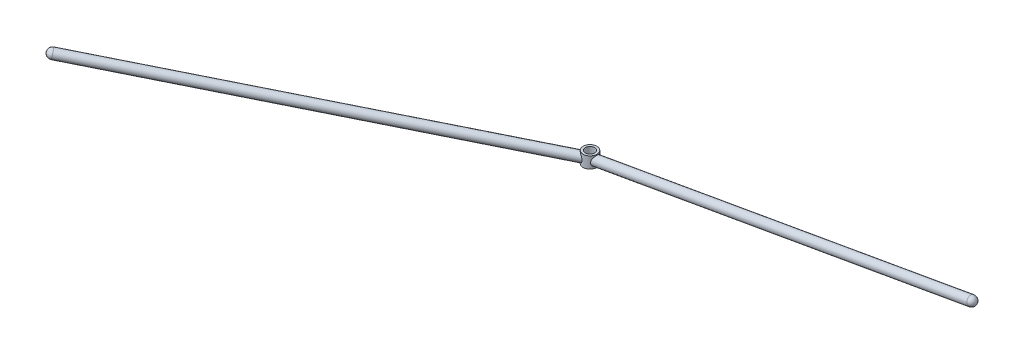
ISO-10303-21;
HEADER;
FILE_DESCRIPTION(('STEP AP214'),'2;1');
FILE_NAME('part.step','',(''),(''),'','','');
FILE_SCHEMA(('AUTOMOTIVE_DESIGN { 1 0 10303 214 1 1 1 1 }'));
ENDSEC;
DATA;
#1=APPLICATION_CONTEXT('core data for automotive mechanical design processes');
#2=APPLICATION_PROTOCOL_DEFINITION('international standard','automotive_design',2000,#1);
#3=PRODUCT_CONTEXT('',#1,'mechanical');
#4=PRODUCT('Part','Part','',(#3));
#5=PRODUCT_RELATED_PRODUCT_CATEGORY('part','',(#4));
#6=PRODUCT_DEFINITION_FORMATION('','',#4);
#7=PRODUCT_DEFINITION_CONTEXT('part definition',#1,'design');
#8=PRODUCT_DEFINITION('design','',#6,#7);
#9=PRODUCT_DEFINITION_SHAPE('','',#8);
#10=(LENGTH_UNIT() NAMED_UNIT(*) SI_UNIT(.MILLI.,.METRE.));
#11=(NAMED_UNIT(*) PLANE_ANGLE_UNIT() SI_UNIT($,.RADIAN.));
#12=(NAMED_UNIT(*) SI_UNIT($,.STERADIAN.) SOLID_ANGLE_UNIT());
#13=UNCERTAINTY_MEASURE_WITH_UNIT(LENGTH_MEASURE(1.E-05),#10,'distance_accuracy_value','');
#14=(GEOMETRIC_REPRESENTATION_CONTEXT(3) GLOBAL_UNCERTAINTY_ASSIGNED_CONTEXT((#13)) GLOBAL_UNIT_ASSIGNED_CONTEXT((#10,
#11,#12)) REPRESENTATION_CONTEXT('',''));
#15=CARTESIAN_POINT('',(0.,0.,0.));
#16=DIRECTION('',(0.,0.,1.));
#17=DIRECTION('',(1.,0.,0.));
#18=AXIS2_PLACEMENT_3D('',#15,#16,#17);
#19=CARTESIAN_POINT('',(0.,5.,0.));
#20=DIRECTION('',(0.,-1.,0.));
#21=DIRECTION('',(0.,0.,-1.));
#22=AXIS2_PLACEMENT_3D('',#19,#20,#21);
#23=CYLINDRICAL_SURFACE('',#22,3.);
#24=CARTESIAN_POINT('',(0.,0.,0.));
#25=DIRECTION('',(0.,1.,0.));
#26=DIRECTION('',(0.,0.,1.));
#27=AXIS2_PLACEMENT_3D('',#24,#25,#26);
#28=CIRCLE('',#27,3.);
#29=CARTESIAN_POINT('',(0.,0.,3.));
#30=VERTEX_POINT('',#29);
#31=EDGE_CURVE('E74',#30,#30,#28,.T.);
#32=ORIENTED_EDGE('',*,*,#31,.T.);
#33=EDGE_LOOP('',(#32));
#34=FACE_BOUND('',#33,.T.);
#35=CARTESIAN_POINT('',(0.,5.,0.));
#36=DIRECTION('',(0.,1.,0.));
#37=DIRECTION('',(0.,0.,1.));
#38=AXIS2_PLACEMENT_3D('',#35,#36,#37);
#39=CIRCLE('',#38,3.);
#40=CARTESIAN_POINT('',(0.,5.,3.));
#41=VERTEX_POINT('',#40);
#42=EDGE_CURVE('E73',#41,#41,#39,.T.);
#43=ORIENTED_EDGE('',*,*,#42,.F.);
#44=EDGE_LOOP('',(#43));
#45=FACE_BOUND('',#44,.T.);
#46=CARTESIAN_POINT('',(3.,0.528980942125396,0.));
#47=CARTESIAN_POINT('',(3.00000060768445,0.52898038671971,-0.105352816166858));
#48=CARTESIAN_POINT('',(2.99440756269553,0.536483614334048,-0.210702594024752));
#49=CARTESIAN_POINT('',(2.97254416575141,0.566163575082191,-0.418175037044795));
#50=CARTESIAN_POINT('',(2.95627103049984,0.588344133229892,-0.520296853707084));
#51=CARTESIAN_POINT('',(2.91452327004026,0.646418224151012,-0.718159576521899));
#52=CARTESIAN_POINT('',(2.88907851128459,0.68226726854435,-0.813920012750273));
#53=CARTESIAN_POINT('',(2.83101088842986,0.766597370008062,-0.997316378282564));
#54=CARTESIAN_POINT('',(2.79838681396916,0.815080557324116,-1.08495093409824));
#55=CARTESIAN_POINT('',(2.72623977201194,0.927040063832617,-1.25567529809672));
#56=CARTESIAN_POINT('',(2.68641555199647,0.991256221659713,-1.33815221701435));
#57=CARTESIAN_POINT('',(2.60476314453413,1.1319830145095,-1.49088084014653));
#58=CARTESIAN_POINT('',(2.56293219855812,1.20851093462922,-1.56111506307257));
#59=CARTESIAN_POINT('',(2.47826282941211,1.37946954172842,-1.69255687315254));
#60=CARTESIAN_POINT('',(2.43557817908405,1.47480502489805,-1.75271466141534));
#61=CARTESIAN_POINT('',(2.37800091411617,1.62688406099546,-1.82924689373969));
#62=CARTESIAN_POINT('',(2.35989391154636,1.67904985893848,-1.852462047487));
#63=CARTESIAN_POINT('',(2.32662796014547,1.78615548728428,-1.894071384172));
#64=CARTESIAN_POINT('',(2.31146749428632,1.84109387176606,-1.91246804961953));
#65=CARTESIAN_POINT('',(2.27905447335245,1.97797694746243,-1.95110550179668));
#66=CARTESIAN_POINT('',(2.26379802310381,2.06120325622948,-1.96861962747218));
#67=CARTESIAN_POINT('',(2.24279496395452,2.23033683113176,-1.99251905158083));
#68=CARTESIAN_POINT('',(2.23704032271644,2.31624177022625,-1.99891375004526));
#69=CARTESIAN_POINT('',(2.23532534003988,2.488036331558,-2.00082941628498));
#70=CARTESIAN_POINT('',(2.23934259562543,2.57392553821387,-1.99637525604013));
#71=CARTESIAN_POINT('',(2.25601136423687,2.74376960986517,-1.97751361327812));
#72=CARTESIAN_POINT('',(2.26867445453381,2.82772172496037,-1.9630927844994));
#73=CARTESIAN_POINT('',(2.30750511570784,3.02666625782287,-1.9174594078452));
#74=CARTESIAN_POINT('',(2.33710640109223,3.13994640447483,-1.88174533322008));
#75=CARTESIAN_POINT('',(2.40449507229547,3.35782529000972,-1.79483125652316));
#76=CARTESIAN_POINT('',(2.44229962232844,3.46240518027785,-1.74359869376483));
#77=CARTESIAN_POINT('',(2.52258741902155,3.66442163258846,-1.62536267251263));
#78=CARTESIAN_POINT('',(2.56516824108385,3.76159479911556,-1.55797658857411));
#79=CARTESIAN_POINT('',(2.65007422046098,3.9441393428976,-1.40871282454417));
#80=CARTESIAN_POINT('',(2.69239958104332,4.02952176551964,-1.32684887333678));
#81=CARTESIAN_POINT('',(2.76800952577604,4.17640392785802,-1.15993212018874));
#82=CARTESIAN_POINT('',(2.80176311670416,4.23955449769646,-1.07655329591663));
#83=CARTESIAN_POINT('',(2.86355508264262,4.35265873080316,-0.899343913600628));
#84=CARTESIAN_POINT('',(2.89160052357344,4.40262873280861,-0.805526502496365));
#85=CARTESIAN_POINT('',(2.93524986143201,4.47939682524608,-0.625594408988866));
#86=CARTESIAN_POINT('',(2.95215635772278,4.50868586394193,-0.540865497342784));
#87=CARTESIAN_POINT('',(2.97877115371131,4.55452533174543,-0.366933425104695));
#88=CARTESIAN_POINT('',(2.98848451471713,4.57108471813525,-0.277733457757884));
#89=CARTESIAN_POINT('',(2.99980310779582,4.59036340361394,-0.0969816579897626));
#90=CARTESIAN_POINT('',(3.00137849798229,4.59303176468015,-0.00542240514973274));
#91=CARTESIAN_POINT('',(2.99617455951865,4.58418356597702,0.176762194073289));
#92=CARTESIAN_POINT('',(2.98939465715188,4.5726660321324,0.267387475894226));
#93=CARTESIAN_POINT('',(2.96876072158394,4.53731305452876,0.440007210115846));
#94=CARTESIAN_POINT('',(2.95531886655568,4.51419443877761,0.522201763395194));
#95=CARTESIAN_POINT('',(2.92267752554253,4.45736358665806,0.68160819998983));
#96=CARTESIAN_POINT('',(2.90347505481411,4.42364585814486,0.758817475023723));
#97=CARTESIAN_POINT('',(2.85262160260887,4.33283380465544,0.93474928262287));
#98=CARTESIAN_POINT('',(2.81899552255241,4.27170793415359,1.03082107569266));
#99=CARTESIAN_POINT('',(2.74668175390765,4.13560771142606,1.21043673620206));
#100=CARTESIAN_POINT('',(2.70798569470586,4.06061037098689,1.29395938419703));
#101=CARTESIAN_POINT('',(2.62813524387254,3.89795160365836,1.44936251425342));
#102=CARTESIAN_POINT('',(2.58695104388081,3.8101035184926,1.52103081332772));
#103=CARTESIAN_POINT('',(2.50610174072881,3.62428554996893,1.65084770459144));
#104=CARTESIAN_POINT('',(2.46643679972301,3.52631459027374,1.70899485697369));
#105=CARTESIAN_POINT('',(2.39462651748582,3.3271655477022,1.80811716052594));
#106=CARTESIAN_POINT('',(2.36218027271072,3.22649417386591,1.84988627972354));
#107=CARTESIAN_POINT('',(2.30612224014837,3.01806455584342,1.91932472328987));
#108=CARTESIAN_POINT('',(2.28249497429231,2.91031912193032,1.94701878180288));
#109=CARTESIAN_POINT('',(2.25220757156907,2.71358907021476,1.98191260091815));
#110=CARTESIAN_POINT('',(2.24298742830287,2.62556867720319,1.99224383133062));
#111=CARTESIAN_POINT('',(2.23452916864881,2.44847239530751,2.00173226935032));
#112=CARTESIAN_POINT('',(2.23527843470254,2.35939798312612,2.00090360121569));
#113=CARTESIAN_POINT('',(2.24727138561336,2.18261861096862,1.98742275071259));
#114=CARTESIAN_POINT('',(2.2585424831831,2.09491783683561,1.97473968376499));
#115=CARTESIAN_POINT('',(2.29038398695863,1.92374214704113,1.93771069174425));
#116=CARTESIAN_POINT('',(2.31096319742044,1.8402713156671,1.91335372338496));
#117=CARTESIAN_POINT('',(2.35846368418658,1.68110090976915,1.85446444158261));
#118=CARTESIAN_POINT('',(2.38524633753269,1.6052771259793,1.82015089994289));
#119=CARTESIAN_POINT('',(2.44280727640162,1.46031026113406,1.74213745468454));
#120=CARTESIAN_POINT('',(2.47358691893091,1.39116946297007,1.69843435993216));
#121=CARTESIAN_POINT('',(2.54299682052757,1.24709007109985,1.5930714203266));
#122=CARTESIAN_POINT('',(2.5819841063596,1.17366749610502,1.52957109627657));
#123=CARTESIAN_POINT('',(2.65893854117567,1.0373691516282,1.39151257879646));
#124=CARTESIAN_POINT('',(2.69690475092346,0.974502831200842,1.31694458981541));
#125=CARTESIAN_POINT('',(2.77401065465476,0.851915096606001,1.14663661209537));
#126=CARTESIAN_POINT('',(2.81256013916164,0.793888852343216,1.04939384515346));
#127=CARTESIAN_POINT('',(2.88081947529461,0.693927647897705,0.844128954370339));
#128=CARTESIAN_POINT('',(2.9105350963109,0.65198218016309,0.736113927725749));
#129=CARTESIAN_POINT('',(2.95557508381903,0.58929856155613,0.524402606206571));
#130=CARTESIAN_POINT('',(2.9721060090513,0.566760938754131,0.421497170673116));
#131=CARTESIAN_POINT('',(2.99431537550236,0.536606238452704,0.212392314852877));
#132=CARTESIAN_POINT('',(2.99999938745999,0.528981501968925,0.106194613898049));
#133=CARTESIAN_POINT('',(3.,0.528980942125396,0.));
#134=B_SPLINE_CURVE_WITH_KNOTS('',3,(#46,#47,#48,#49,#50,#51,#52,#53,#54,#55,#56,#57,#58,#59,
#60,#61,#62,#63,#64,#65,#66,#67,#68,#69,#70,#71,#72,#73,#74,#75,#76,#77,#78,#79,#80,#81,#82,#83,
#84,#85,#86,#87,#88,#89,#90,#91,#92,#93,#94,#95,#96,#97,#98,#99,#100,#101,#102,#103,#104,#105,
#106,#107,#108,#109,#110,#111,#112,#113,#114,#115,#116,#117,#118,#119,#120,#121,#122,#123,#124,
#125,#126,#127,#128,#129,#130,#131,#132,#133),.UNSPECIFIED.,.T.,.F.,(4,2,2,2,2,2,2,2,2,2,2,2,2,
2,2,2,2,2,2,2,2,2,2,2,2,2,2,2,2,2,2,2,2,2,2,2,2,2,2,2,2,2,2,4),(0.,0.315650714673574,
0.63138372252156,0.946097731595019,1.2608648390414,1.59502976983552,1.92966801264527,
2.28902165024823,2.46844640271535,2.6477785319863,2.9057221437757,3.16344759154294,
3.42058273702477,3.67806287833263,4.04329238998324,4.40929359293557,4.78501274831266,
5.16037751350541,5.48888126852336,5.8169758732818,6.08951312651938,6.36185843159964,
6.63520171979458,6.90856377816817,7.16680034839535,7.4251709503158,7.77943311680552,
8.13428772477881,8.49493200935408,8.8556146797775,9.19559842306838,9.53498262804957,
9.80118718232618,10.0670548528851,10.3336171320661,10.6004320732375,10.8617787118568,
11.1232143126517,11.4358455407401,11.7487551347571,12.1058133487732,12.462637853403,
12.7809742380579,13.0991470880206),.UNSPECIFIED.);
#135=CARTESIAN_POINT('',(3.,0.528980942125396,0.));
#136=VERTEX_POINT('',#135);
#137=EDGE_CURVE('E46',#136,#136,#134,.T.);
#138=ORIENTED_EDGE('',*,*,#137,.F.);
#139=EDGE_LOOP('',(#138));
#140=FACE_BOUND('',#139,.T.);
#141=CARTESIAN_POINT('',(-2.99850266797311,2.42513233890292,-0.0947720958842282));
#142=CARTESIAN_POINT('',(-2.99850772575305,2.33300030838246,-0.0947580738950632));
#143=CARTESIAN_POINT('',(-2.99880567636641,2.24079146391625,-0.0863948523966926));
#144=CARTESIAN_POINT('',(-2.99957823963719,2.05944824644581,-0.0528544290015935));
#145=CARTESIAN_POINT('',(-3.00005301550848,1.97031679726349,-0.0276616759471098));
#146=CARTESIAN_POINT('',(-2.99993902875457,1.7982930375469,0.0374446952547342));
#147=CARTESIAN_POINT('',(-2.99935645668109,1.71536735155355,0.0772715456532838));
#148=CARTESIAN_POINT('',(-2.99558957228238,1.55654700674992,0.16894405193866));
#149=CARTESIAN_POINT('',(-2.9924034931308,1.48065716164903,0.220797852593839));
#150=CARTESIAN_POINT('',(-2.9814559781336,1.33040408082559,0.338688817739777));
#151=CARTESIAN_POINT('',(-2.97332707777821,1.25672457081368,0.405559018021943));
#152=CARTESIAN_POINT('',(-2.95050549632421,1.11882251598727,0.547440276040599));
#153=CARTESIAN_POINT('',(-2.93580947019475,1.05460481283218,0.622455467749826));
#154=CARTESIAN_POINT('',(-2.89502775271706,0.925360501651675,0.792303327565005));
#155=CARTESIAN_POINT('',(-2.86736127653136,0.86229395149993,0.888264524213738));
#156=CARTESIAN_POINT('',(-2.79911884567986,0.751243285531258,1.08429802891863));
#157=CARTESIAN_POINT('',(-2.75854266651044,0.703259432035816,1.18437040844313));
#158=CARTESIAN_POINT('',(-2.66443890389404,0.624547791947431,1.38297738696405));
#159=CARTESIAN_POINT('',(-2.61114041005973,0.593543587599598,1.4815095693859));
#160=CARTESIAN_POINT('',(-2.49168883618101,0.548937665170014,1.67461681240823));
#161=CARTESIAN_POINT('',(-2.42554657669439,0.535321370851301,1.76919512310148));
#162=CARTESIAN_POINT('',(-2.2895275099363,0.526609116117448,1.94135848502349));
#163=CARTESIAN_POINT('',(-2.22070493197636,0.529779360468929,2.01969477361224));
#164=CARTESIAN_POINT('',(-2.07637028895227,0.550552768476142,2.16780382895817));
#165=CARTESIAN_POINT('',(-2.00085862462811,0.568155068035201,2.23757710812457));
#166=CARTESIAN_POINT('',(-1.84765134174909,0.616514875963724,2.36557137403998));
#167=CARTESIAN_POINT('',(-1.77004745945715,0.646956665829968,2.42402343968906));
#168=CARTESIAN_POINT('',(-1.61365697338272,0.719986594002448,2.53082714479069));
#169=CARTESIAN_POINT('',(-1.53487020442835,0.76257644382639,2.57917735934801));
#170=CARTESIAN_POINT('',(-1.37252964404516,0.862763096251452,2.66935342025253));
#171=CARTESIAN_POINT('',(-1.28909080541583,0.921279471688508,2.71036238409087));
#172=CARTESIAN_POINT('',(-1.12702227443767,1.05046310563711,2.78166799122602));
#173=CARTESIAN_POINT('',(-1.04839938471066,1.12114703781757,2.81194975817346));
#174=CARTESIAN_POINT('',(-0.892931324651001,1.28084688232729,2.86531032417418));
#175=CARTESIAN_POINT('',(-0.816876281542525,1.37093775186613,2.8875009118794));
#176=CARTESIAN_POINT('',(-0.680528489380737,1.56389787375012,2.9226435703635));
#177=CARTESIAN_POINT('',(-0.620200912884166,1.66673813465128,2.93561616571571));
#178=CARTESIAN_POINT('',(-0.53503517919187,1.85395269988318,2.95213386138593));
#179=CARTESIAN_POINT('',(-0.505013636958384,1.93582685171823,2.95727795641155));
#180=CARTESIAN_POINT('',(-0.459044702578307,2.10350847162496,2.96476489112749));
#181=CARTESIAN_POINT('',(-0.443078220856437,2.18931043768714,2.96711153185894));
#182=CARTESIAN_POINT('',(-0.426140902806215,2.36242600687907,2.96959278262785));
#183=CARTESIAN_POINT('',(-0.425174806453039,2.44974007909468,2.96972669346515));
#184=CARTESIAN_POINT('',(-0.437457623787536,2.62337247244883,2.96793827339634));
#185=CARTESIAN_POINT('',(-0.450725640577386,2.70968929789234,2.96601317918256));
#186=CARTESIAN_POINT('',(-0.495636118036339,2.90609855688274,2.95888652257546));
#187=CARTESIAN_POINT('',(-0.53174674497237,3.01512548190201,2.95284456274402));
#188=CARTESIAN_POINT('',(-0.620123472774728,3.22596803149037,2.93555037363409));
#189=CARTESIAN_POINT('',(-0.672419456153722,3.32776988569477,2.92428848767311));
#190=CARTESIAN_POINT('',(-0.790593931239924,3.52566794312894,2.8946112859253));
#191=CARTESIAN_POINT('',(-0.856793049999138,3.62154410136214,2.87601587922842));
#192=CARTESIAN_POINT('',(-0.998659034300568,3.8036122858666,2.82988436187864));
#193=CARTESIAN_POINT('',(-1.0743233424531,3.88980691608568,2.80235066306036));
#194=CARTESIAN_POINT('',(-1.23298096969011,4.05147651355986,2.73627254820656));
#195=CARTESIAN_POINT('',(-1.31600982811399,4.12689433961318,2.69767248186452));
#196=CARTESIAN_POINT('',(-1.48639639026959,4.26400741845262,2.60765686290216));
#197=CARTESIAN_POINT('',(-1.57374893710742,4.32571855897355,2.55625629585218));
#198=CARTESIAN_POINT('',(-1.73165844303403,4.42132171687055,2.45121195421256));
#199=CARTESIAN_POINT('',(-1.80203225574742,4.45831690570599,2.40013296818603));
#200=CARTESIAN_POINT('',(-1.94124169620845,4.51955822443061,2.28899276688439));
#201=CARTESIAN_POINT('',(-2.01007859018191,4.54381525029376,2.22893928489386));
#202=CARTESIAN_POINT('',(-2.14410262937102,4.57805811633893,2.1003537922865));
#203=CARTESIAN_POINT('',(-2.20926682028198,4.58796210411576,2.03177555601542));
#204=CARTESIAN_POINT('',(-2.33297983196465,4.59242868830338,1.88842792758243));
#205=CARTESIAN_POINT('',(-2.39152970784453,4.58699373516909,1.81365952617555));
#206=CARTESIAN_POINT('',(-2.49530917904521,4.56240708383942,1.66755749431192));
#207=CARTESIAN_POINT('',(-2.54126175389483,4.54452560660472,1.5965147135029));
#208=CARTESIAN_POINT('',(-2.62558247610957,4.49753706639095,1.45368539560322));
#209=CARTESIAN_POINT('',(-2.66394903445624,4.46842765529273,1.3818987059955));
#210=CARTESIAN_POINT('',(-2.73566946868514,4.39793969311891,1.23423466201932));
#211=CARTESIAN_POINT('',(-2.76845781093938,4.35582429344528,1.1584383321349));
#212=CARTESIAN_POINT('',(-2.82606814410794,4.2620720482545,1.00980504827312));
#213=CARTESIAN_POINT('',(-2.85088537181204,4.21042953863541,0.936969886386144));
#214=CARTESIAN_POINT('',(-2.9037780390664,4.07235804585187,0.761588968978037));
#215=CARTESIAN_POINT('',(-2.92770191497296,3.9811282756434,0.66155868908584));
#216=CARTESIAN_POINT('',(-2.96386191838249,3.78413971951263,0.473992127160165));
#217=CARTESIAN_POINT('',(-2.97606017756338,3.67833511287875,0.386497097110463));
#218=CARTESIAN_POINT('',(-2.98833651020409,3.50969886421038,0.267340660654922));
#219=CARTESIAN_POINT('',(-2.9914250975918,3.45142324897005,0.229431759734243));
#220=CARTESIAN_POINT('',(-2.99601637987037,3.33188047993467,0.158568956111447));
#221=CARTESIAN_POINT('',(-2.99751863392859,3.27061249952539,0.125616432937841));
#222=CARTESIAN_POINT('',(-3.00038790808656,3.08310868166768,0.0356916701651749));
#223=CARTESIAN_POINT('',(-3.00015644481357,2.95246307317018,-0.0128660824662686));
#224=CARTESIAN_POINT('',(-2.99940617653172,2.75386628292439,-0.0616924194432777));
#225=CARTESIAN_POINT('',(-2.99910014848953,2.68874770664137,-0.0739380230010705));
#226=CARTESIAN_POINT('',(-2.99864658195601,2.55747670913496,-0.0904826666032432));
#227=CARTESIAN_POINT('',(-2.99849903422472,2.49132434841315,-0.0947821699446274));
#228=CARTESIAN_POINT('',(-2.99850266797311,2.42513233890292,-0.0947720958842282));
#229=B_SPLINE_CURVE_WITH_KNOTS('',3,(#141,#142,#143,#144,#145,#146,#147,#148,#149,#150,#151,
#152,#153,#154,#155,#156,#157,#158,#159,#160,#161,#162,#163,#164,#165,#166,#167,#168,#169,#170,
#171,#172,#173,#174,#175,#176,#177,#178,#179,#180,#181,#182,#183,#184,#185,#186,#187,#188,#189,
#190,#191,#192,#193,#194,#195,#196,#197,#198,#199,#200,#201,#202,#203,#204,#205,#206,#207,#208,
#209,#210,#211,#212,#213,#214,#215,#216,#217,#218,#219,#220,#221,#222,#223,#224,#225,#226,#227,
#228),.UNSPECIFIED.,.T.,.F.,(4,2,2,2,2,2,2,2,2,2,2,2,2,2,2,2,2,2,2,2,2,2,2,2,2,2,2,2,2,2,2,2,2,
2,2,2,2,2,2,2,2,2,2,4),(0.,0.276118243491916,0.552491984817924,0.827252832130858,
1.10220029628319,1.4006259298859,1.69920374312694,2.05185917215214,2.40452073429661,
2.75125625678261,3.09770092061391,3.40910762546654,3.72049568669252,4.02463629326096,
4.32881977082024,4.65702737990408,4.98568837782185,5.3437900766067,5.70109191434038,
5.96202928394307,6.22261169929946,6.48327645447725,6.7442914767829,7.08744118980567,
7.43122826727831,7.78404360728058,8.13676382553754,8.49128987971079,8.84540282477558,
9.1277649975686,9.40988524826866,9.69360812586042,9.97728568019475,10.2355926918707,
10.493953753098,10.7710569810065,11.0483254876688,11.4586507336232,11.8702967320558,
12.0788269637745,12.2874151295694,12.7019846069752,12.9003725836744,13.098748993007),.UNSPECIFIED.);
#230=CARTESIAN_POINT('',(-2.99850266797311,2.42513233890292,-0.0947720958842282));
#231=VERTEX_POINT('',#230);
#232=EDGE_CURVE('E38',#231,#231,#229,.T.);
#233=ORIENTED_EDGE('',*,*,#232,.F.);
#234=EDGE_LOOP('',(#233));
#235=FACE_BOUND('',#234,.T.);
#236=ADVANCED_FACE('F31',(#34,#45,#140,#235),#23,.T.);
#237=CARTESIAN_POINT('',(0.,5.,0.));
#238=DIRECTION('',(0.,1.,0.));
#239=DIRECTION('',(0.,0.,1.));
#240=AXIS2_PLACEMENT_3D('',#237,#238,#239);
#241=PLANE('',#240);
#242=CARTESIAN_POINT('',(0.,5.,0.));
#243=DIRECTION('',(0.,1.,0.));
#244=DIRECTION('',(0.,0.,1.));
#245=AXIS2_PLACEMENT_3D('',#242,#243,#244);
#246=CIRCLE('',#245,2.);
#247=CARTESIAN_POINT('',(0.,5.,2.));
#248=VERTEX_POINT('',#247);
#249=EDGE_CURVE('E80',#248,#248,#246,.T.);
#250=ORIENTED_EDGE('',*,*,#249,.F.);
#251=EDGE_LOOP('',(#250));
#252=FACE_BOUND('',#251,.T.);
#253=ORIENTED_EDGE('',*,*,#42,.T.);
#254=EDGE_LOOP('',(#253));
#255=FACE_BOUND('',#254,.T.);
#256=ADVANCED_FACE('F68',(#252,#255),#241,.T.);
#257=CARTESIAN_POINT('',(0.,0.,0.));
#258=DIRECTION('',(0.,1.,0.));
#259=DIRECTION('',(0.,0.,1.));
#260=AXIS2_PLACEMENT_3D('',#257,#258,#259);
#261=PLANE('',#260);
#262=CARTESIAN_POINT('',(0.,0.,0.));
#263=DIRECTION('',(0.,1.,0.));
#264=DIRECTION('',(0.,0.,1.));
#265=AXIS2_PLACEMENT_3D('',#262,#263,#264);
#266=CIRCLE('',#265,2.);
#267=CARTESIAN_POINT('',(0.,0.,2.));
#268=VERTEX_POINT('',#267);
#269=EDGE_CURVE('E77',#268,#268,#266,.T.);
#270=ORIENTED_EDGE('',*,*,#269,.T.);
#271=EDGE_LOOP('',(#270));
#272=FACE_BOUND('',#271,.T.);
#273=ORIENTED_EDGE('',*,*,#31,.F.);
#274=EDGE_LOOP('',(#273));
#275=FACE_BOUND('',#274,.T.);
#276=ADVANCED_FACE('F66',(#272,#275),#261,.F.);
#277=CARTESIAN_POINT('',(167.497546835899,31.5651899334203,0.));
#278=DIRECTION('',(-0.984807753012208,-0.173648177666931,0.));
#279=DIRECTION('',(0.173648177666931,-0.984807753012208,0.));
#280=AXIS2_PLACEMENT_3D('',#277,#278,#279);
#281=CYLINDRICAL_SURFACE('',#280,2.);
#282=CARTESIAN_POINT('',(165.527931329874,31.2178935780864,0.));
#283=DIRECTION('',(-0.984807753012208,-0.173648177666931,0.));
#284=DIRECTION('',(0.173648177666931,-0.984807753012208,0.));
#285=AXIS2_PLACEMENT_3D('',#282,#283,#284);
#286=CIRCLE('',#285,2.);
#287=CARTESIAN_POINT('',(165.875227685208,29.248278072062,0.));
#288=VERTEX_POINT('',#287);
#289=EDGE_CURVE('E42',#288,#288,#286,.T.);
#290=ORIENTED_EDGE('',*,*,#289,.T.);
#291=EDGE_LOOP('',(#290));
#292=FACE_BOUND('',#291,.T.);
#293=ORIENTED_EDGE('',*,*,#137,.T.);
#294=EDGE_LOOP('',(#293));
#295=FACE_BOUND('',#294,.T.);
#296=ADVANCED_FACE('F62',(#292,#295),#281,.T.);
#297=CARTESIAN_POINT('',(165.527931329874,31.2178935780864,0.));
#298=DIRECTION('',(0.984807753012208,0.173648177666931,0.));
#299=DIRECTION('',(-0.173648177666931,0.984807753012208,0.));
#300=AXIS2_PLACEMENT_3D('',#297,#298,#299);
#301=SPHERICAL_SURFACE('',#300,2.);
#302=ORIENTED_EDGE('',*,*,#289,.F.);
#303=EDGE_LOOP('',(#302));
#304=FACE_BOUND('',#303,.T.);
#305=ADVANCED_FACE('F60',(#304),#301,.T.);
#306=CARTESIAN_POINT('',(-128.310564989702,31.5651899334203,107.665347759006));
#307=DIRECTION('',(0.754406506735492,-0.173648177666931,-0.633022221559485));
#308=DIRECTION('',(-0.642787609686535,0.,-0.766044443118982));
#309=AXIS2_PLACEMENT_3D('',#306,#307,#308);
#310=CYLINDRICAL_SURFACE('',#309,2.);
#311=CARTESIAN_POINT('',(-126.801751976231,31.2178935780864,106.399303315887));
#312=DIRECTION('',(0.754406506735492,-0.173648177666931,-0.633022221559485));
#313=DIRECTION('',(-0.642787609686535,0.,-0.766044443118982));
#314=AXIS2_PLACEMENT_3D('',#311,#312,#313);
#315=CIRCLE('',#314,2.);
#316=CARTESIAN_POINT('',(-128.087327195604,31.2178935780864,104.867214429649));
#317=VERTEX_POINT('',#316);
#318=EDGE_CURVE('E10',#317,#317,#315,.T.);
#319=ORIENTED_EDGE('',*,*,#318,.T.);
#320=EDGE_LOOP('',(#319));
#321=FACE_BOUND('',#320,.T.);
#322=ORIENTED_EDGE('',*,*,#232,.T.);
#323=EDGE_LOOP('',(#322));
#324=FACE_BOUND('',#323,.T.);
#325=ADVANCED_FACE('F55',(#321,#324),#310,.T.);
#326=CARTESIAN_POINT('',(-126.801751976231,31.2178935780864,106.399303315887));
#327=DIRECTION('',(-0.754406506735493,0.173648177666931,0.633022221559485));
#328=DIRECTION('',(0.642787609686535,0.,0.766044443118982));
#329=AXIS2_PLACEMENT_3D('',#326,#327,#328);
#330=SPHERICAL_SURFACE('',#329,2.);
#331=ORIENTED_EDGE('',*,*,#318,.F.);
#332=EDGE_LOOP('',(#331));
#333=FACE_BOUND('',#332,.T.);
#334=ADVANCED_FACE('F33',(#333),#330,.T.);
#335=CARTESIAN_POINT('',(0.,0.,0.));
#336=DIRECTION('',(0.,1.,0.));
#337=DIRECTION('',(0.,0.,1.));
#338=AXIS2_PLACEMENT_3D('',#335,#336,#337);
#339=CYLINDRICAL_SURFACE('',#338,2.);
#340=ORIENTED_EDGE('',*,*,#269,.F.);
#341=EDGE_LOOP('',(#340));
#342=FACE_BOUND('',#341,.T.);
#343=ORIENTED_EDGE('',*,*,#249,.T.);
#344=EDGE_LOOP('',(#343));
#345=FACE_BOUND('',#344,.T.);
#346=ADVANCED_FACE('F61',(#342,#345),#339,.F.);
#347=CLOSED_SHELL('',(#236,#256,#276,#296,#305,#325,#334,#346));
#348=MANIFOLD_SOLID_BREP('B2',#347);
#349=ADVANCED_BREP_SHAPE_REPRESENTATION('',(#18,#348),#14);
#350=SHAPE_DEFINITION_REPRESENTATION(#9,#349);
ENDSEC;
END-ISO-10303-21;
